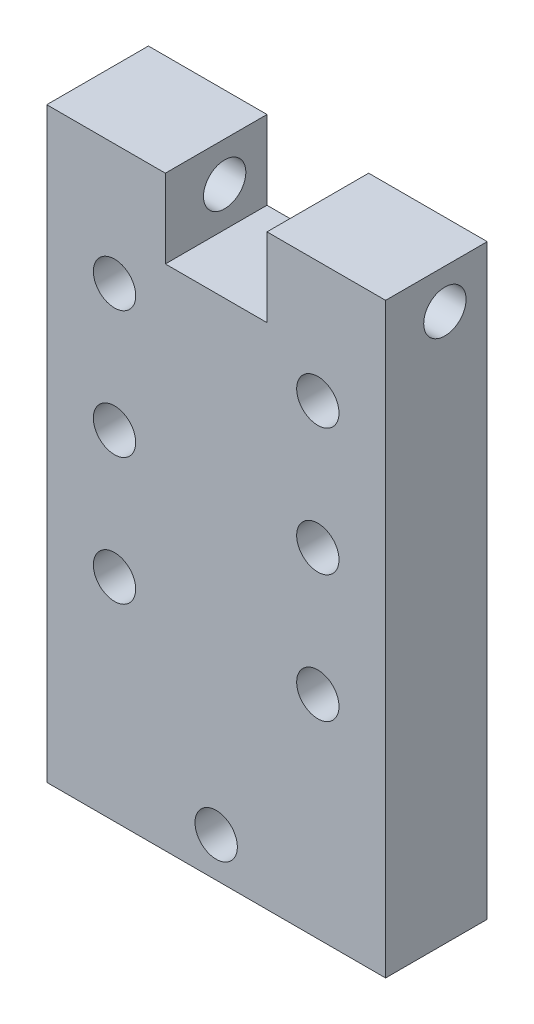
ISO-10303-21;
HEADER;
FILE_DESCRIPTION(('STEP AP214'),'2;1');
FILE_NAME('part.step','',(''),(''),'','','');
FILE_SCHEMA(('AUTOMOTIVE_DESIGN { 1 0 10303 214 1 1 1 1 }'));
ENDSEC;
DATA;
#1=APPLICATION_CONTEXT('core data for automotive mechanical design processes');
#2=APPLICATION_PROTOCOL_DEFINITION('international standard','automotive_design',2000,#1);
#3=PRODUCT_CONTEXT('',#1,'mechanical');
#4=PRODUCT('Part','Part','',(#3));
#5=PRODUCT_RELATED_PRODUCT_CATEGORY('part','',(#4));
#6=PRODUCT_DEFINITION_FORMATION('','',#4);
#7=PRODUCT_DEFINITION_CONTEXT('part definition',#1,'design');
#8=PRODUCT_DEFINITION('design','',#6,#7);
#9=PRODUCT_DEFINITION_SHAPE('','',#8);
#10=(LENGTH_UNIT() NAMED_UNIT(*) SI_UNIT(.MILLI.,.METRE.));
#11=(NAMED_UNIT(*) PLANE_ANGLE_UNIT() SI_UNIT($,.RADIAN.));
#12=(NAMED_UNIT(*) SI_UNIT($,.STERADIAN.) SOLID_ANGLE_UNIT());
#13=UNCERTAINTY_MEASURE_WITH_UNIT(LENGTH_MEASURE(1.E-05),#10,'distance_accuracy_value','');
#14=(GEOMETRIC_REPRESENTATION_CONTEXT(3) GLOBAL_UNCERTAINTY_ASSIGNED_CONTEXT((#13)) GLOBAL_UNIT_ASSIGNED_CONTEXT((#10,
#11,#12)) REPRESENTATION_CONTEXT('',''));
#15=CARTESIAN_POINT('',(0.,0.,0.));
#16=DIRECTION('',(0.,0.,1.));
#17=DIRECTION('',(1.,0.,0.));
#18=AXIS2_PLACEMENT_3D('',#15,#16,#17);
#19=CARTESIAN_POINT('',(12.,-9.64101615137754,12.));
#20=DIRECTION('',(0.,0.,-1.));
#21=DIRECTION('',(-1.,0.,0.));
#22=AXIS2_PLACEMENT_3D('',#19,#20,#21);
#23=CYLINDRICAL_SURFACE('',#22,2.5);
#24=CARTESIAN_POINT('',(12.,-9.64101615137754,12.));
#25=DIRECTION('',(0.,0.,-1.));
#26=DIRECTION('',(-1.,0.,0.));
#27=AXIS2_PLACEMENT_3D('',#24,#25,#26);
#28=CIRCLE('',#27,2.5);
#29=CARTESIAN_POINT('',(9.5,-9.64101615137754,12.));
#30=VERTEX_POINT('',#29);
#31=EDGE_CURVE('E180',#30,#30,#28,.T.);
#32=ORIENTED_EDGE('',*,*,#31,.F.);
#33=EDGE_LOOP('',(#32));
#34=FACE_BOUND('',#33,.T.);
#35=CARTESIAN_POINT('',(12.,-9.64101615137754,3.));
#36=DIRECTION('',(0.,0.,-1.));
#37=DIRECTION('',(-1.,0.,0.));
#38=AXIS2_PLACEMENT_3D('',#35,#36,#37);
#39=CIRCLE('',#38,2.5);
#40=CARTESIAN_POINT('',(9.5,-9.64101615137754,3.));
#41=VERTEX_POINT('',#40);
#42=EDGE_CURVE('E37',#41,#41,#39,.F.);
#43=ORIENTED_EDGE('',*,*,#42,.F.);
#44=EDGE_LOOP('',(#43));
#45=FACE_BOUND('',#44,.T.);
#46=ADVANCED_FACE('F33',(#34,#45),#23,.F.);
#47=CARTESIAN_POINT('',(12.,5.35898384862245,12.));
#48=DIRECTION('',(0.,0.,-1.));
#49=DIRECTION('',(-1.,0.,0.));
#50=AXIS2_PLACEMENT_3D('',#47,#48,#49);
#51=CYLINDRICAL_SURFACE('',#50,2.5);
#52=CARTESIAN_POINT('',(12.,5.35898384862245,12.));
#53=DIRECTION('',(0.,0.,-1.));
#54=DIRECTION('',(-1.,0.,0.));
#55=AXIS2_PLACEMENT_3D('',#52,#53,#54);
#56=CIRCLE('',#55,2.5);
#57=CARTESIAN_POINT('',(9.5,5.35898384862245,12.));
#58=VERTEX_POINT('',#57);
#59=EDGE_CURVE('E183',#58,#58,#56,.T.);
#60=ORIENTED_EDGE('',*,*,#59,.F.);
#61=EDGE_LOOP('',(#60));
#62=FACE_BOUND('',#61,.T.);
#63=CARTESIAN_POINT('',(12.,5.35898384862245,3.));
#64=DIRECTION('',(0.,0.,-1.));
#65=DIRECTION('',(-1.,0.,0.));
#66=AXIS2_PLACEMENT_3D('',#63,#64,#65);
#67=CIRCLE('',#66,2.5);
#68=CARTESIAN_POINT('',(9.5,5.35898384862245,3.));
#69=VERTEX_POINT('',#68);
#70=EDGE_CURVE('E162',#69,#69,#67,.F.);
#71=ORIENTED_EDGE('',*,*,#70,.F.);
#72=EDGE_LOOP('',(#71));
#73=FACE_BOUND('',#72,.T.);
#74=ADVANCED_FACE('F245',(#62,#73),#51,.F.);
#75=CARTESIAN_POINT('',(12.,20.3589838486225,12.));
#76=DIRECTION('',(0.,0.,-1.));
#77=DIRECTION('',(-1.,0.,0.));
#78=AXIS2_PLACEMENT_3D('',#75,#76,#77);
#79=CYLINDRICAL_SURFACE('',#78,2.5);
#80=CARTESIAN_POINT('',(12.,20.3589838486225,12.));
#81=DIRECTION('',(0.,0.,-1.));
#82=DIRECTION('',(-1.,0.,0.));
#83=AXIS2_PLACEMENT_3D('',#80,#81,#82);
#84=CIRCLE('',#83,2.5);
#85=CARTESIAN_POINT('',(9.50000000000001,20.3589838486225,12.));
#86=VERTEX_POINT('',#85);
#87=EDGE_CURVE('E338',#86,#86,#84,.T.);
#88=ORIENTED_EDGE('',*,*,#87,.F.);
#89=EDGE_LOOP('',(#88));
#90=FACE_BOUND('',#89,.T.);
#91=CARTESIAN_POINT('',(12.,20.3589838486225,3.));
#92=DIRECTION('',(0.,0.,-1.));
#93=DIRECTION('',(-1.,0.,0.));
#94=AXIS2_PLACEMENT_3D('',#91,#92,#93);
#95=CIRCLE('',#94,2.5);
#96=CARTESIAN_POINT('',(9.50000000000001,20.3589838486225,3.));
#97=VERTEX_POINT('',#96);
#98=EDGE_CURVE('E160',#97,#97,#95,.F.);
#99=ORIENTED_EDGE('',*,*,#98,.F.);
#100=EDGE_LOOP('',(#99));
#101=FACE_BOUND('',#100,.T.);
#102=ADVANCED_FACE('F251',(#90,#101),#79,.F.);
#103=CARTESIAN_POINT('',(-12.,20.3589838486225,12.));
#104=DIRECTION('',(0.,0.,-1.));
#105=DIRECTION('',(-1.,0.,0.));
#106=AXIS2_PLACEMENT_3D('',#103,#104,#105);
#107=CYLINDRICAL_SURFACE('',#106,2.5);
#108=CARTESIAN_POINT('',(-12.,20.3589838486225,12.));
#109=DIRECTION('',(0.,0.,-1.));
#110=DIRECTION('',(1.,0.,0.));
#111=AXIS2_PLACEMENT_3D('',#108,#109,#110);
#112=CIRCLE('',#111,2.5);
#113=CARTESIAN_POINT('',(-9.50000000000001,20.3589838486225,12.));
#114=VERTEX_POINT('',#113);
#115=EDGE_CURVE('E176',#114,#114,#112,.T.);
#116=ORIENTED_EDGE('',*,*,#115,.F.);
#117=EDGE_LOOP('',(#116));
#118=FACE_BOUND('',#117,.T.);
#119=CARTESIAN_POINT('',(-12.,20.3589838486225,3.));
#120=DIRECTION('',(0.,0.,-1.));
#121=DIRECTION('',(-1.,0.,0.));
#122=AXIS2_PLACEMENT_3D('',#119,#120,#121);
#123=CIRCLE('',#122,2.5);
#124=CARTESIAN_POINT('',(-14.5,20.3589838486225,3.));
#125=VERTEX_POINT('',#124);
#126=EDGE_CURVE('E157',#125,#125,#123,.F.);
#127=ORIENTED_EDGE('',*,*,#126,.F.);
#128=EDGE_LOOP('',(#127));
#129=FACE_BOUND('',#128,.T.);
#130=ADVANCED_FACE('F345',(#118,#129),#107,.F.);
#131=CARTESIAN_POINT('',(-12.,5.35898384862245,12.));
#132=DIRECTION('',(0.,0.,-1.));
#133=DIRECTION('',(-1.,0.,0.));
#134=AXIS2_PLACEMENT_3D('',#131,#132,#133);
#135=CYLINDRICAL_SURFACE('',#134,2.5);
#136=CARTESIAN_POINT('',(-12.,5.35898384862245,12.));
#137=DIRECTION('',(0.,0.,-1.));
#138=DIRECTION('',(1.,0.,0.));
#139=AXIS2_PLACEMENT_3D('',#136,#137,#138);
#140=CIRCLE('',#139,2.5);
#141=CARTESIAN_POINT('',(-9.5,5.35898384862245,12.));
#142=VERTEX_POINT('',#141);
#143=EDGE_CURVE('E171',#142,#142,#140,.T.);
#144=ORIENTED_EDGE('',*,*,#143,.F.);
#145=EDGE_LOOP('',(#144));
#146=FACE_BOUND('',#145,.T.);
#147=CARTESIAN_POINT('',(-12.,5.35898384862245,3.));
#148=DIRECTION('',(0.,0.,-1.));
#149=DIRECTION('',(-1.,0.,0.));
#150=AXIS2_PLACEMENT_3D('',#147,#148,#149);
#151=CIRCLE('',#150,2.5);
#152=CARTESIAN_POINT('',(-14.5,5.35898384862245,3.));
#153=VERTEX_POINT('',#152);
#154=EDGE_CURVE('E153',#153,#153,#151,.F.);
#155=ORIENTED_EDGE('',*,*,#154,.F.);
#156=EDGE_LOOP('',(#155));
#157=FACE_BOUND('',#156,.T.);
#158=ADVANCED_FACE('F348',(#146,#157),#135,.F.);
#159=CARTESIAN_POINT('',(-12.,-9.64101615137754,12.));
#160=DIRECTION('',(0.,0.,-1.));
#161=DIRECTION('',(-1.,0.,0.));
#162=AXIS2_PLACEMENT_3D('',#159,#160,#161);
#163=CYLINDRICAL_SURFACE('',#162,2.5);
#164=CARTESIAN_POINT('',(-12.,-9.64101615137754,12.));
#165=DIRECTION('',(0.,0.,-1.));
#166=DIRECTION('',(1.,0.,0.));
#167=AXIS2_PLACEMENT_3D('',#164,#165,#166);
#168=CIRCLE('',#167,2.5);
#169=CARTESIAN_POINT('',(-9.5,-9.64101615137754,12.));
#170=VERTEX_POINT('',#169);
#171=EDGE_CURVE('E167',#170,#170,#168,.T.);
#172=ORIENTED_EDGE('',*,*,#171,.F.);
#173=EDGE_LOOP('',(#172));
#174=FACE_BOUND('',#173,.T.);
#175=CARTESIAN_POINT('',(-12.,-9.64101615137754,3.));
#176=DIRECTION('',(0.,0.,-1.));
#177=DIRECTION('',(-1.,0.,0.));
#178=AXIS2_PLACEMENT_3D('',#175,#176,#177);
#179=CIRCLE('',#178,2.5);
#180=CARTESIAN_POINT('',(-14.5,-9.64101615137754,3.));
#181=VERTEX_POINT('',#180);
#182=EDGE_CURVE('E150',#181,#181,#179,.F.);
#183=ORIENTED_EDGE('',*,*,#182,.F.);
#184=EDGE_LOOP('',(#183));
#185=FACE_BOUND('',#184,.T.);
#186=ADVANCED_FACE('F243',(#174,#185),#163,.F.);
#187=CARTESIAN_POINT('',(-20.,34.6410161513776,12.));
#188=DIRECTION('',(0.,-1.,0.));
#189=DIRECTION('',(0.,0.,-1.));
#190=AXIS2_PLACEMENT_3D('',#187,#188,#189);
#191=PLANE('',#190);
#192=DIRECTION('',(-1.,0.,0.));
#193=VECTOR('',#192,1.);
#194=CARTESIAN_POINT('',(-20.,34.6410161513776,0.));
#195=LINE('',#194,#193);
#196=CARTESIAN_POINT('',(20.,34.6410161513776,0.));
#197=VERTEX_POINT('',#196);
#198=CARTESIAN_POINT('',(6.,34.6410161513776,0.));
#199=VERTEX_POINT('',#198);
#200=EDGE_CURVE('E121',#197,#199,#195,.T.);
#201=ORIENTED_EDGE('',*,*,#200,.T.);
#202=DIRECTION('',(0.,0.,1.));
#203=VECTOR('',#202,1.);
#204=CARTESIAN_POINT('',(6.,34.6410161513776,0.));
#205=LINE('',#204,#203);
#206=CARTESIAN_POINT('',(6.,34.6410161513776,12.));
#207=VERTEX_POINT('',#206);
#208=EDGE_CURVE('E109',#199,#207,#205,.T.);
#209=ORIENTED_EDGE('',*,*,#208,.T.);
#210=DIRECTION('',(-1.,0.,0.));
#211=VECTOR('',#210,1.);
#212=CARTESIAN_POINT('',(-20.,34.6410161513776,12.));
#213=LINE('',#212,#211);
#214=CARTESIAN_POINT('',(20.,34.6410161513776,12.));
#215=VERTEX_POINT('',#214);
#216=EDGE_CURVE('E87',#215,#207,#213,.T.);
#217=ORIENTED_EDGE('',*,*,#216,.F.);
#218=DIRECTION('',(0.,0.,-1.));
#219=VECTOR('',#218,1.);
#220=CARTESIAN_POINT('',(20.,34.6410161513776,12.));
#221=LINE('',#220,#219);
#222=EDGE_CURVE('E11',#215,#197,#221,.T.);
#223=ORIENTED_EDGE('',*,*,#222,.T.);
#224=EDGE_LOOP('',(#201,#209,#217,#223));
#225=FACE_BOUND('',#224,.T.);
#226=ADVANCED_FACE('F126',(#225),#191,.F.);
#227=CARTESIAN_POINT('',(20.,-34.6410161513775,12.));
#228=DIRECTION('',(-1.,0.,0.));
#229=DIRECTION('',(0.,0.,1.));
#230=AXIS2_PLACEMENT_3D('',#227,#228,#229);
#231=PLANE('',#230);
#232=CARTESIAN_POINT('',(20.,30.,5.));
#233=DIRECTION('',(-1.,0.,0.));
#234=DIRECTION('',(0.,0.,1.));
#235=AXIS2_PLACEMENT_3D('',#232,#233,#234);
#236=CIRCLE('',#235,2.5);
#237=CARTESIAN_POINT('',(20.,30.,7.5));
#238=VERTEX_POINT('',#237);
#239=EDGE_CURVE('E188',#238,#238,#236,.T.);
#240=ORIENTED_EDGE('',*,*,#239,.T.);
#241=EDGE_LOOP('',(#240));
#242=FACE_BOUND('',#241,.T.);
#243=DIRECTION('',(0.,1.,0.));
#244=VECTOR('',#243,1.);
#245=CARTESIAN_POINT('',(20.,-34.6410161513775,0.));
#246=LINE('',#245,#244);
#247=CARTESIAN_POINT('',(20.,-34.6410161513775,0.));
#248=VERTEX_POINT('',#247);
#249=EDGE_CURVE('E133',#248,#197,#246,.T.);
#250=ORIENTED_EDGE('',*,*,#249,.T.);
#251=ORIENTED_EDGE('',*,*,#222,.F.);
#252=DIRECTION('',(0.,1.,0.));
#253=VECTOR('',#252,1.);
#254=CARTESIAN_POINT('',(20.,-34.6410161513775,12.));
#255=LINE('',#254,#253);
#256=CARTESIAN_POINT('',(20.,-34.6410161513775,12.));
#257=VERTEX_POINT('',#256);
#258=EDGE_CURVE('E138',#257,#215,#255,.T.);
#259=ORIENTED_EDGE('',*,*,#258,.F.);
#260=DIRECTION('',(0.,0.,-1.));
#261=VECTOR('',#260,1.);
#262=CARTESIAN_POINT('',(20.,-34.6410161513775,12.));
#263=LINE('',#262,#261);
#264=EDGE_CURVE('E139',#257,#248,#263,.T.);
#265=ORIENTED_EDGE('',*,*,#264,.T.);
#266=EDGE_LOOP('',(#250,#251,#259,#265));
#267=FACE_BOUND('',#266,.T.);
#268=ADVANCED_FACE('F35',(#242,#267),#231,.F.);
#269=CARTESIAN_POINT('',(-6.,34.6410161513776,12.));
#270=VERTEX_POINT('',#269);
#271=CARTESIAN_POINT('',(-20.,34.6410161513776,12.));
#272=VERTEX_POINT('',#271);
#273=EDGE_CURVE('E211',#270,#272,#213,.T.);
#274=ORIENTED_EDGE('',*,*,#273,.F.);
#275=DIRECTION('',(0.,0.,1.));
#276=VECTOR('',#275,1.);
#277=CARTESIAN_POINT('',(-6.,34.6410161513776,0.));
#278=LINE('',#277,#276);
#279=CARTESIAN_POINT('',(-6.,34.6410161513776,0.));
#280=VERTEX_POINT('',#279);
#281=EDGE_CURVE('E116',#280,#270,#278,.T.);
#282=ORIENTED_EDGE('',*,*,#281,.F.);
#283=CARTESIAN_POINT('',(-20.,34.6410161513776,0.));
#284=VERTEX_POINT('',#283);
#285=EDGE_CURVE('E130',#280,#284,#195,.T.);
#286=ORIENTED_EDGE('',*,*,#285,.T.);
#287=DIRECTION('',(0.,0.,-1.));
#288=VECTOR('',#287,1.);
#289=CARTESIAN_POINT('',(-20.,34.6410161513776,12.));
#290=LINE('',#289,#288);
#291=EDGE_CURVE('E42',#272,#284,#290,.T.);
#292=ORIENTED_EDGE('',*,*,#291,.F.);
#293=EDGE_LOOP('',(#274,#282,#286,#292));
#294=FACE_BOUND('',#293,.T.);
#295=ADVANCED_FACE('F233',(#294),#191,.F.);
#296=CARTESIAN_POINT('',(-20.,-34.6410161513775,12.));
#297=DIRECTION('',(1.,0.,0.));
#298=DIRECTION('',(0.,0.,-1.));
#299=AXIS2_PLACEMENT_3D('',#296,#297,#298);
#300=PLANE('',#299);
#301=CARTESIAN_POINT('',(-20.,30.,5.));
#302=DIRECTION('',(-1.,0.,0.));
#303=DIRECTION('',(0.,0.,1.));
#304=AXIS2_PLACEMENT_3D('',#301,#302,#303);
#305=CIRCLE('',#304,2.5);
#306=CARTESIAN_POINT('',(-20.,30.,7.5));
#307=VERTEX_POINT('',#306);
#308=EDGE_CURVE('E149',#307,#307,#305,.T.);
#309=ORIENTED_EDGE('',*,*,#308,.F.);
#310=EDGE_LOOP('',(#309));
#311=FACE_BOUND('',#310,.T.);
#312=DIRECTION('',(0.,-1.,0.));
#313=VECTOR('',#312,1.);
#314=CARTESIAN_POINT('',(-20.,-34.6410161513775,0.));
#315=LINE('',#314,#313);
#316=CARTESIAN_POINT('',(-20.,-34.6410161513775,0.));
#317=VERTEX_POINT('',#316);
#318=EDGE_CURVE('E129',#284,#317,#315,.T.);
#319=ORIENTED_EDGE('',*,*,#318,.T.);
#320=DIRECTION('',(0.,0.,-1.));
#321=VECTOR('',#320,1.);
#322=CARTESIAN_POINT('',(-20.,-34.6410161513775,12.));
#323=LINE('',#322,#321);
#324=CARTESIAN_POINT('',(-20.,-34.6410161513775,12.));
#325=VERTEX_POINT('',#324);
#326=EDGE_CURVE('E141',#325,#317,#323,.T.);
#327=ORIENTED_EDGE('',*,*,#326,.F.);
#328=DIRECTION('',(0.,-1.,0.));
#329=VECTOR('',#328,1.);
#330=CARTESIAN_POINT('',(-20.,-34.6410161513775,12.));
#331=LINE('',#330,#329);
#332=EDGE_CURVE('E213',#272,#325,#331,.T.);
#333=ORIENTED_EDGE('',*,*,#332,.F.);
#334=ORIENTED_EDGE('',*,*,#291,.T.);
#335=EDGE_LOOP('',(#319,#327,#333,#334));
#336=FACE_BOUND('',#335,.T.);
#337=ADVANCED_FACE('F221',(#311,#336),#300,.F.);
#338=CARTESIAN_POINT('',(-20.,-34.6410161513775,12.));
#339=DIRECTION('',(0.,1.,0.));
#340=DIRECTION('',(0.,0.,1.));
#341=AXIS2_PLACEMENT_3D('',#338,#339,#340);
#342=PLANE('',#341);
#343=CARTESIAN_POINT('',(-10.,-34.6410161513775,6.));
#344=DIRECTION('',(0.,-1.,0.));
#345=DIRECTION('',(0.,0.,-1.));
#346=AXIS2_PLACEMENT_3D('',#343,#344,#345);
#347=CIRCLE('',#346,2.5);
#348=CARTESIAN_POINT('',(-10.,-34.6410161513775,3.5));
#349=VERTEX_POINT('',#348);
#350=EDGE_CURVE('E289',#349,#349,#347,.T.);
#351=ORIENTED_EDGE('',*,*,#350,.F.);
#352=EDGE_LOOP('',(#351));
#353=FACE_BOUND('',#352,.T.);
#354=CARTESIAN_POINT('',(10.,-34.6410161513775,6.));
#355=DIRECTION('',(0.,-1.,0.));
#356=DIRECTION('',(0.,0.,-1.));
#357=AXIS2_PLACEMENT_3D('',#354,#355,#356);
#358=CIRCLE('',#357,2.5);
#359=CARTESIAN_POINT('',(10.,-34.6410161513775,3.5));
#360=VERTEX_POINT('',#359);
#361=EDGE_CURVE('E292',#360,#360,#358,.T.);
#362=ORIENTED_EDGE('',*,*,#361,.F.);
#363=EDGE_LOOP('',(#362));
#364=FACE_BOUND('',#363,.T.);
#365=DIRECTION('',(1.,0.,0.));
#366=VECTOR('',#365,1.);
#367=CARTESIAN_POINT('',(-20.,-34.6410161513775,0.));
#368=LINE('',#367,#366);
#369=EDGE_CURVE('E80',#317,#248,#368,.T.);
#370=ORIENTED_EDGE('',*,*,#369,.T.);
#371=ORIENTED_EDGE('',*,*,#264,.F.);
#372=DIRECTION('',(1.,0.,0.));
#373=VECTOR('',#372,1.);
#374=CARTESIAN_POINT('',(-20.,-34.6410161513775,12.));
#375=LINE('',#374,#373);
#376=EDGE_CURVE('E59',#325,#257,#375,.T.);
#377=ORIENTED_EDGE('',*,*,#376,.F.);
#378=ORIENTED_EDGE('',*,*,#326,.T.);
#379=EDGE_LOOP('',(#370,#371,#377,#378));
#380=FACE_BOUND('',#379,.T.);
#381=ADVANCED_FACE('F223',(#353,#364,#380),#342,.F.);
#382=CARTESIAN_POINT('',(0.,0.,12.));
#383=DIRECTION('',(0.,0.,-1.));
#384=DIRECTION('',(-1.,0.,0.));
#385=AXIS2_PLACEMENT_3D('',#382,#383,#384);
#386=PLANE('',#385);
#387=ORIENTED_EDGE('',*,*,#171,.T.);
#388=EDGE_LOOP('',(#387));
#389=FACE_BOUND('',#388,.T.);
#390=ORIENTED_EDGE('',*,*,#143,.T.);
#391=EDGE_LOOP('',(#390));
#392=FACE_BOUND('',#391,.T.);
#393=ORIENTED_EDGE('',*,*,#115,.T.);
#394=EDGE_LOOP('',(#393));
#395=FACE_BOUND('',#394,.T.);
#396=ORIENTED_EDGE('',*,*,#87,.T.);
#397=EDGE_LOOP('',(#396));
#398=FACE_BOUND('',#397,.T.);
#399=ORIENTED_EDGE('',*,*,#59,.T.);
#400=EDGE_LOOP('',(#399));
#401=FACE_BOUND('',#400,.T.);
#402=ORIENTED_EDGE('',*,*,#31,.T.);
#403=EDGE_LOOP('',(#402));
#404=FACE_BOUND('',#403,.T.);
#405=CARTESIAN_POINT('',(0.,-30.,12.));
#406=DIRECTION('',(0.,0.,1.));
#407=DIRECTION('',(1.,0.,0.));
#408=AXIS2_PLACEMENT_3D('',#405,#406,#407);
#409=CIRCLE('',#408,2.5);
#410=CARTESIAN_POINT('',(2.5,-30.,12.));
#411=VERTEX_POINT('',#410);
#412=EDGE_CURVE('E194',#411,#411,#409,.T.);
#413=ORIENTED_EDGE('',*,*,#412,.F.);
#414=EDGE_LOOP('',(#413));
#415=FACE_BOUND('',#414,.T.);
#416=ORIENTED_EDGE('',*,*,#216,.T.);
#417=DIRECTION('',(0.,1.,0.));
#418=VECTOR('',#417,1.);
#419=CARTESIAN_POINT('',(6.,25.3589838486224,12.));
#420=LINE('',#419,#418);
#421=CARTESIAN_POINT('',(6.,25.3589838486224,12.));
#422=VERTEX_POINT('',#421);
#423=EDGE_CURVE('E114',#422,#207,#420,.T.);
#424=ORIENTED_EDGE('',*,*,#423,.F.);
#425=DIRECTION('',(1.,0.,0.));
#426=VECTOR('',#425,1.);
#427=CARTESIAN_POINT('',(-6.,25.3589838486224,12.));
#428=LINE('',#427,#426);
#429=CARTESIAN_POINT('',(-6.,25.3589838486224,12.));
#430=VERTEX_POINT('',#429);
#431=EDGE_CURVE('E124',#430,#422,#428,.T.);
#432=ORIENTED_EDGE('',*,*,#431,.F.);
#433=DIRECTION('',(0.,-1.,0.));
#434=VECTOR('',#433,1.);
#435=CARTESIAN_POINT('',(-6.,25.3589838486224,12.));
#436=LINE('',#435,#434);
#437=EDGE_CURVE('E201',#270,#430,#436,.T.);
#438=ORIENTED_EDGE('',*,*,#437,.F.);
#439=ORIENTED_EDGE('',*,*,#273,.T.);
#440=ORIENTED_EDGE('',*,*,#332,.T.);
#441=ORIENTED_EDGE('',*,*,#376,.T.);
#442=ORIENTED_EDGE('',*,*,#258,.T.);
#443=EDGE_LOOP('',(#416,#424,#432,#438,#439,#440,#441,#442));
#444=FACE_BOUND('',#443,.T.);
#445=ADVANCED_FACE('F216',(#389,#392,#395,#398,#401,#404,#415,#444),#386,.F.);
#446=CARTESIAN_POINT('',(0.,0.,0.));
#447=DIRECTION('',(0.,0.,-1.));
#448=DIRECTION('',(-1.,0.,0.));
#449=AXIS2_PLACEMENT_3D('',#446,#447,#448);
#450=PLANE('',#449);
#451=CARTESIAN_POINT('',(12.,5.35898384862245,0.));
#452=DIRECTION('',(0.,0.,-1.));
#453=DIRECTION('',(-1.,0.,0.));
#454=AXIS2_PLACEMENT_3D('',#451,#452,#453);
#455=CIRCLE('',#454,4.5);
#456=CARTESIAN_POINT('',(7.5,5.35898384862245,0.));
#457=VERTEX_POINT('',#456);
#458=EDGE_CURVE('E312',#457,#457,#455,.T.);
#459=ORIENTED_EDGE('',*,*,#458,.F.);
#460=EDGE_LOOP('',(#459));
#461=FACE_BOUND('',#460,.T.);
#462=CARTESIAN_POINT('',(12.,20.3589838486225,0.));
#463=DIRECTION('',(0.,0.,-1.));
#464=DIRECTION('',(-1.,0.,0.));
#465=AXIS2_PLACEMENT_3D('',#462,#463,#464);
#466=CIRCLE('',#465,4.5);
#467=CARTESIAN_POINT('',(7.50000000000001,20.3589838486225,0.));
#468=VERTEX_POINT('',#467);
#469=EDGE_CURVE('E318',#468,#468,#466,.T.);
#470=ORIENTED_EDGE('',*,*,#469,.F.);
#471=EDGE_LOOP('',(#470));
#472=FACE_BOUND('',#471,.T.);
#473=CARTESIAN_POINT('',(-12.,-9.64101615137754,0.));
#474=DIRECTION('',(0.,0.,-1.));
#475=DIRECTION('',(-1.,0.,0.));
#476=AXIS2_PLACEMENT_3D('',#473,#474,#475);
#477=CIRCLE('',#476,4.5);
#478=CARTESIAN_POINT('',(-16.5,-9.64101615137754,0.));
#479=VERTEX_POINT('',#478);
#480=EDGE_CURVE('E324',#479,#479,#477,.T.);
#481=ORIENTED_EDGE('',*,*,#480,.F.);
#482=EDGE_LOOP('',(#481));
#483=FACE_BOUND('',#482,.T.);
#484=CARTESIAN_POINT('',(-12.,5.35898384862245,0.));
#485=DIRECTION('',(0.,0.,-1.));
#486=DIRECTION('',(-1.,0.,0.));
#487=AXIS2_PLACEMENT_3D('',#484,#485,#486);
#488=CIRCLE('',#487,4.5);
#489=CARTESIAN_POINT('',(-16.5,5.35898384862245,0.));
#490=VERTEX_POINT('',#489);
#491=EDGE_CURVE('E303',#490,#490,#488,.T.);
#492=ORIENTED_EDGE('',*,*,#491,.F.);
#493=EDGE_LOOP('',(#492));
#494=FACE_BOUND('',#493,.T.);
#495=CARTESIAN_POINT('',(-12.,20.3589838486225,0.));
#496=DIRECTION('',(0.,0.,-1.));
#497=DIRECTION('',(-1.,0.,0.));
#498=AXIS2_PLACEMENT_3D('',#495,#496,#497);
#499=CIRCLE('',#498,4.5);
#500=CARTESIAN_POINT('',(-16.5,20.3589838486225,0.));
#501=VERTEX_POINT('',#500);
#502=EDGE_CURVE('E304',#501,#501,#499,.T.);
#503=ORIENTED_EDGE('',*,*,#502,.F.);
#504=EDGE_LOOP('',(#503));
#505=FACE_BOUND('',#504,.T.);
#506=CARTESIAN_POINT('',(12.,-9.64101615137754,0.));
#507=DIRECTION('',(0.,0.,-1.));
#508=DIRECTION('',(-1.,0.,0.));
#509=AXIS2_PLACEMENT_3D('',#506,#507,#508);
#510=CIRCLE('',#509,4.5);
#511=CARTESIAN_POINT('',(7.5,-9.64101615137754,0.));
#512=VERTEX_POINT('',#511);
#513=EDGE_CURVE('E311',#512,#512,#510,.T.);
#514=ORIENTED_EDGE('',*,*,#513,.F.);
#515=EDGE_LOOP('',(#514));
#516=FACE_BOUND('',#515,.T.);
#517=CARTESIAN_POINT('',(0.,-30.,0.));
#518=DIRECTION('',(0.,0.,1.));
#519=DIRECTION('',(1.,0.,0.));
#520=AXIS2_PLACEMENT_3D('',#517,#518,#519);
#521=CIRCLE('',#520,2.5);
#522=CARTESIAN_POINT('',(2.5,-30.,0.));
#523=VERTEX_POINT('',#522);
#524=EDGE_CURVE('E191',#523,#523,#521,.T.);
#525=ORIENTED_EDGE('',*,*,#524,.T.);
#526=EDGE_LOOP('',(#525));
#527=FACE_BOUND('',#526,.T.);
#528=DIRECTION('',(0.,1.,0.));
#529=VECTOR('',#528,1.);
#530=CARTESIAN_POINT('',(6.,25.3589838486224,0.));
#531=LINE('',#530,#529);
#532=CARTESIAN_POINT('',(6.,25.3589838486224,0.));
#533=VERTEX_POINT('',#532);
#534=EDGE_CURVE('E112',#533,#199,#531,.T.);
#535=ORIENTED_EDGE('',*,*,#534,.T.);
#536=ORIENTED_EDGE('',*,*,#200,.F.);
#537=ORIENTED_EDGE('',*,*,#249,.F.);
#538=ORIENTED_EDGE('',*,*,#369,.F.);
#539=ORIENTED_EDGE('',*,*,#318,.F.);
#540=ORIENTED_EDGE('',*,*,#285,.F.);
#541=DIRECTION('',(0.,-1.,0.));
#542=VECTOR('',#541,1.);
#543=CARTESIAN_POINT('',(-6.,25.3589838486224,0.));
#544=LINE('',#543,#542);
#545=CARTESIAN_POINT('',(-6.,25.3589838486224,0.));
#546=VERTEX_POINT('',#545);
#547=EDGE_CURVE('E123',#280,#546,#544,.T.);
#548=ORIENTED_EDGE('',*,*,#547,.T.);
#549=DIRECTION('',(1.,0.,0.));
#550=VECTOR('',#549,1.);
#551=CARTESIAN_POINT('',(-6.,25.3589838486224,0.));
#552=LINE('',#551,#550);
#553=EDGE_CURVE('E50',#546,#533,#552,.T.);
#554=ORIENTED_EDGE('',*,*,#553,.T.);
#555=EDGE_LOOP('',(#535,#536,#537,#538,#539,#540,#548,#554));
#556=FACE_BOUND('',#555,.T.);
#557=ADVANCED_FACE('F119',(#461,#472,#483,#494,#505,#516,#527,#556),#450,.T.);
#558=CARTESIAN_POINT('',(6.,25.3589838486224,0.));
#559=DIRECTION('',(1.,0.,0.));
#560=DIRECTION('',(0.,0.,-1.));
#561=AXIS2_PLACEMENT_3D('',#558,#559,#560);
#562=PLANE('',#561);
#563=CARTESIAN_POINT('',(6.00000000000001,30.,5.));
#564=DIRECTION('',(1.,0.,0.));
#565=DIRECTION('',(0.,0.,-1.));
#566=AXIS2_PLACEMENT_3D('',#563,#564,#565);
#567=CIRCLE('',#566,2.5);
#568=CARTESIAN_POINT('',(6.00000000000001,30.,2.5));
#569=VERTEX_POINT('',#568);
#570=EDGE_CURVE('E148',#569,#569,#567,.T.);
#571=ORIENTED_EDGE('',*,*,#570,.T.);
#572=EDGE_LOOP('',(#571));
#573=FACE_BOUND('',#572,.T.);
#574=ORIENTED_EDGE('',*,*,#423,.T.);
#575=ORIENTED_EDGE('',*,*,#208,.F.);
#576=ORIENTED_EDGE('',*,*,#534,.F.);
#577=DIRECTION('',(0.,0.,1.));
#578=VECTOR('',#577,1.);
#579=CARTESIAN_POINT('',(6.,25.3589838486224,0.));
#580=LINE('',#579,#578);
#581=EDGE_CURVE('E196',#533,#422,#580,.T.);
#582=ORIENTED_EDGE('',*,*,#581,.T.);
#583=EDGE_LOOP('',(#574,#575,#576,#582));
#584=FACE_BOUND('',#583,.T.);
#585=ADVANCED_FACE('F111',(#573,#584),#562,.F.);
#586=CARTESIAN_POINT('',(-6.,25.3589838486224,0.));
#587=DIRECTION('',(0.,-1.,0.));
#588=DIRECTION('',(0.,0.,-1.));
#589=AXIS2_PLACEMENT_3D('',#586,#587,#588);
#590=PLANE('',#589);
#591=ORIENTED_EDGE('',*,*,#431,.T.);
#592=ORIENTED_EDGE('',*,*,#581,.F.);
#593=ORIENTED_EDGE('',*,*,#553,.F.);
#594=DIRECTION('',(0.,0.,1.));
#595=VECTOR('',#594,1.);
#596=CARTESIAN_POINT('',(-6.,25.3589838486224,0.));
#597=LINE('',#596,#595);
#598=EDGE_CURVE('E207',#546,#430,#597,.T.);
#599=ORIENTED_EDGE('',*,*,#598,.T.);
#600=EDGE_LOOP('',(#591,#592,#593,#599));
#601=FACE_BOUND('',#600,.T.);
#602=ADVANCED_FACE('F227',(#601),#590,.F.);
#603=CARTESIAN_POINT('',(-6.,25.3589838486224,0.));
#604=DIRECTION('',(-1.,0.,0.));
#605=DIRECTION('',(0.,0.,1.));
#606=AXIS2_PLACEMENT_3D('',#603,#604,#605);
#607=PLANE('',#606);
#608=CARTESIAN_POINT('',(-6.,30.,5.));
#609=DIRECTION('',(-1.,0.,0.));
#610=DIRECTION('',(0.,0.,1.));
#611=AXIS2_PLACEMENT_3D('',#608,#609,#610);
#612=CIRCLE('',#611,2.5);
#613=CARTESIAN_POINT('',(-6.,30.,7.5));
#614=VERTEX_POINT('',#613);
#615=EDGE_CURVE('E145',#614,#614,#612,.T.);
#616=ORIENTED_EDGE('',*,*,#615,.T.);
#617=EDGE_LOOP('',(#616));
#618=FACE_BOUND('',#617,.T.);
#619=ORIENTED_EDGE('',*,*,#437,.T.);
#620=ORIENTED_EDGE('',*,*,#598,.F.);
#621=ORIENTED_EDGE('',*,*,#547,.F.);
#622=ORIENTED_EDGE('',*,*,#281,.T.);
#623=EDGE_LOOP('',(#619,#620,#621,#622));
#624=FACE_BOUND('',#623,.T.);
#625=ADVANCED_FACE('F229',(#618,#624),#607,.F.);
#626=CARTESIAN_POINT('',(0.,-30.,0.));
#627=DIRECTION('',(0.,0.,1.));
#628=DIRECTION('',(1.,0.,0.));
#629=AXIS2_PLACEMENT_3D('',#626,#627,#628);
#630=CYLINDRICAL_SURFACE('',#629,2.5);
#631=ORIENTED_EDGE('',*,*,#524,.F.);
#632=EDGE_LOOP('',(#631));
#633=FACE_BOUND('',#632,.T.);
#634=ORIENTED_EDGE('',*,*,#412,.T.);
#635=EDGE_LOOP('',(#634));
#636=FACE_BOUND('',#635,.T.);
#637=ADVANCED_FACE('F265',(#633,#636),#630,.F.);
#638=CARTESIAN_POINT('',(40.,30.,5.));
#639=DIRECTION('',(-1.,0.,0.));
#640=DIRECTION('',(0.,0.,1.));
#641=AXIS2_PLACEMENT_3D('',#638,#639,#640);
#642=CYLINDRICAL_SURFACE('',#641,2.5);
#643=ORIENTED_EDGE('',*,*,#308,.T.);
#644=EDGE_LOOP('',(#643));
#645=FACE_BOUND('',#644,.T.);
#646=ORIENTED_EDGE('',*,*,#615,.F.);
#647=EDGE_LOOP('',(#646));
#648=FACE_BOUND('',#647,.T.);
#649=ADVANCED_FACE('F263',(#645,#648),#642,.F.);
#650=ORIENTED_EDGE('',*,*,#570,.F.);
#651=EDGE_LOOP('',(#650));
#652=FACE_BOUND('',#651,.T.);
#653=ORIENTED_EDGE('',*,*,#239,.F.);
#654=EDGE_LOOP('',(#653));
#655=FACE_BOUND('',#654,.T.);
#656=ADVANCED_FACE('F259',(#652,#655),#642,.F.);
#657=CARTESIAN_POINT('',(-12.,-9.64101615137754,3.));
#658=DIRECTION('',(0.,0.,-1.));
#659=DIRECTION('',(-1.,0.,0.));
#660=AXIS2_PLACEMENT_3D('',#657,#658,#659);
#661=PLANE('',#660);
#662=CARTESIAN_POINT('',(-12.,-9.64101615137754,3.));
#663=DIRECTION('',(0.,0.,-1.));
#664=DIRECTION('',(-1.,0.,0.));
#665=AXIS2_PLACEMENT_3D('',#662,#663,#664);
#666=CIRCLE('',#665,4.5);
#667=CARTESIAN_POINT('',(-16.5,-9.64101615137754,3.));
#668=VERTEX_POINT('',#667);
#669=EDGE_CURVE('E321',#668,#668,#666,.T.);
#670=ORIENTED_EDGE('',*,*,#669,.T.);
#671=EDGE_LOOP('',(#670));
#672=FACE_BOUND('',#671,.T.);
#673=ORIENTED_EDGE('',*,*,#182,.T.);
#674=EDGE_LOOP('',(#673));
#675=FACE_BOUND('',#674,.T.);
#676=ADVANCED_FACE('F262',(#672,#675),#661,.T.);
#677=CARTESIAN_POINT('',(-12.,-9.64101615137754,3.));
#678=DIRECTION('',(0.,0.,-1.));
#679=DIRECTION('',(-1.,0.,0.));
#680=AXIS2_PLACEMENT_3D('',#677,#678,#679);
#681=CYLINDRICAL_SURFACE('',#680,4.5);
#682=ORIENTED_EDGE('',*,*,#669,.F.);
#683=EDGE_LOOP('',(#682));
#684=FACE_BOUND('',#683,.T.);
#685=ORIENTED_EDGE('',*,*,#480,.T.);
#686=EDGE_LOOP('',(#685));
#687=FACE_BOUND('',#686,.T.);
#688=ADVANCED_FACE('F390',(#684,#687),#681,.F.);
#689=CARTESIAN_POINT('',(-12.,5.35898384862245,3.));
#690=DIRECTION('',(0.,0.,-1.));
#691=DIRECTION('',(-1.,0.,0.));
#692=AXIS2_PLACEMENT_3D('',#689,#690,#691);
#693=PLANE('',#692);
#694=CARTESIAN_POINT('',(-12.,5.35898384862245,3.));
#695=DIRECTION('',(0.,0.,-1.));
#696=DIRECTION('',(-1.,0.,0.));
#697=AXIS2_PLACEMENT_3D('',#694,#695,#696);
#698=CIRCLE('',#697,4.5);
#699=CARTESIAN_POINT('',(-16.5,5.35898384862245,3.));
#700=VERTEX_POINT('',#699);
#701=EDGE_CURVE('E327',#700,#700,#698,.T.);
#702=ORIENTED_EDGE('',*,*,#701,.T.);
#703=EDGE_LOOP('',(#702));
#704=FACE_BOUND('',#703,.T.);
#705=ORIENTED_EDGE('',*,*,#154,.T.);
#706=EDGE_LOOP('',(#705));
#707=FACE_BOUND('',#706,.T.);
#708=ADVANCED_FACE('F365',(#704,#707),#693,.T.);
#709=CARTESIAN_POINT('',(-12.,5.35898384862245,3.));
#710=DIRECTION('',(0.,0.,-1.));
#711=DIRECTION('',(-1.,0.,0.));
#712=AXIS2_PLACEMENT_3D('',#709,#710,#711);
#713=CYLINDRICAL_SURFACE('',#712,4.5);
#714=ORIENTED_EDGE('',*,*,#701,.F.);
#715=EDGE_LOOP('',(#714));
#716=FACE_BOUND('',#715,.T.);
#717=ORIENTED_EDGE('',*,*,#491,.T.);
#718=EDGE_LOOP('',(#717));
#719=FACE_BOUND('',#718,.T.);
#720=ADVANCED_FACE('F355',(#716,#719),#713,.F.);
#721=CARTESIAN_POINT('',(-12.,20.3589838486225,3.));
#722=DIRECTION('',(0.,0.,-1.));
#723=DIRECTION('',(-1.,0.,0.));
#724=AXIS2_PLACEMENT_3D('',#721,#722,#723);
#725=PLANE('',#724);
#726=CARTESIAN_POINT('',(-12.,20.3589838486225,3.));
#727=DIRECTION('',(0.,0.,-1.));
#728=DIRECTION('',(-1.,0.,0.));
#729=AXIS2_PLACEMENT_3D('',#726,#727,#728);
#730=CIRCLE('',#729,4.5);
#731=CARTESIAN_POINT('',(-16.5,20.3589838486225,3.));
#732=VERTEX_POINT('',#731);
#733=EDGE_CURVE('E300',#732,#732,#730,.T.);
#734=ORIENTED_EDGE('',*,*,#733,.T.);
#735=EDGE_LOOP('',(#734));
#736=FACE_BOUND('',#735,.T.);
#737=ORIENTED_EDGE('',*,*,#126,.T.);
#738=EDGE_LOOP('',(#737));
#739=FACE_BOUND('',#738,.T.);
#740=ADVANCED_FACE('F352',(#736,#739),#725,.T.);
#741=CARTESIAN_POINT('',(-12.,20.3589838486225,3.));
#742=DIRECTION('',(0.,0.,-1.));
#743=DIRECTION('',(-1.,0.,0.));
#744=AXIS2_PLACEMENT_3D('',#741,#742,#743);
#745=CYLINDRICAL_SURFACE('',#744,4.5);
#746=ORIENTED_EDGE('',*,*,#733,.F.);
#747=EDGE_LOOP('',(#746));
#748=FACE_BOUND('',#747,.T.);
#749=ORIENTED_EDGE('',*,*,#502,.T.);
#750=EDGE_LOOP('',(#749));
#751=FACE_BOUND('',#750,.T.);
#752=ADVANCED_FACE('F354',(#748,#751),#745,.F.);
#753=CARTESIAN_POINT('',(12.,20.3589838486225,3.));
#754=DIRECTION('',(0.,0.,-1.));
#755=DIRECTION('',(-1.,0.,0.));
#756=AXIS2_PLACEMENT_3D('',#753,#754,#755);
#757=PLANE('',#756);
#758=CARTESIAN_POINT('',(12.,20.3589838486225,3.));
#759=DIRECTION('',(0.,0.,-1.));
#760=DIRECTION('',(-1.,0.,0.));
#761=AXIS2_PLACEMENT_3D('',#758,#759,#760);
#762=CIRCLE('',#761,4.5);
#763=CARTESIAN_POINT('',(7.50000000000001,20.3589838486225,3.));
#764=VERTEX_POINT('',#763);
#765=EDGE_CURVE('E315',#764,#764,#762,.T.);
#766=ORIENTED_EDGE('',*,*,#765,.T.);
#767=EDGE_LOOP('',(#766));
#768=FACE_BOUND('',#767,.T.);
#769=ORIENTED_EDGE('',*,*,#98,.T.);
#770=EDGE_LOOP('',(#769));
#771=FACE_BOUND('',#770,.T.);
#772=ADVANCED_FACE('F362',(#768,#771),#757,.T.);
#773=CARTESIAN_POINT('',(12.,20.3589838486225,3.));
#774=DIRECTION('',(0.,0.,-1.));
#775=DIRECTION('',(-1.,0.,0.));
#776=AXIS2_PLACEMENT_3D('',#773,#774,#775);
#777=CYLINDRICAL_SURFACE('',#776,4.5);
#778=ORIENTED_EDGE('',*,*,#765,.F.);
#779=EDGE_LOOP('',(#778));
#780=FACE_BOUND('',#779,.T.);
#781=ORIENTED_EDGE('',*,*,#469,.T.);
#782=EDGE_LOOP('',(#781));
#783=FACE_BOUND('',#782,.T.);
#784=ADVANCED_FACE('F376',(#780,#783),#777,.F.);
#785=CARTESIAN_POINT('',(12.,5.35898384862245,3.));
#786=DIRECTION('',(0.,0.,-1.));
#787=DIRECTION('',(-1.,0.,0.));
#788=AXIS2_PLACEMENT_3D('',#785,#786,#787);
#789=PLANE('',#788);
#790=CARTESIAN_POINT('',(12.,5.35898384862245,3.));
#791=DIRECTION('',(0.,0.,-1.));
#792=DIRECTION('',(-1.,0.,0.));
#793=AXIS2_PLACEMENT_3D('',#790,#791,#792);
#794=CIRCLE('',#793,4.5);
#795=CARTESIAN_POINT('',(7.5,5.35898384862245,3.));
#796=VERTEX_POINT('',#795);
#797=EDGE_CURVE('E308',#796,#796,#794,.T.);
#798=ORIENTED_EDGE('',*,*,#797,.T.);
#799=EDGE_LOOP('',(#798));
#800=FACE_BOUND('',#799,.T.);
#801=ORIENTED_EDGE('',*,*,#70,.T.);
#802=EDGE_LOOP('',(#801));
#803=FACE_BOUND('',#802,.T.);
#804=ADVANCED_FACE('F372',(#800,#803),#789,.T.);
#805=CARTESIAN_POINT('',(12.,5.35898384862245,3.));
#806=DIRECTION('',(0.,0.,-1.));
#807=DIRECTION('',(-1.,0.,0.));
#808=AXIS2_PLACEMENT_3D('',#805,#806,#807);
#809=CYLINDRICAL_SURFACE('',#808,4.5);
#810=ORIENTED_EDGE('',*,*,#797,.F.);
#811=EDGE_LOOP('',(#810));
#812=FACE_BOUND('',#811,.T.);
#813=ORIENTED_EDGE('',*,*,#458,.T.);
#814=EDGE_LOOP('',(#813));
#815=FACE_BOUND('',#814,.T.);
#816=ADVANCED_FACE('F375',(#812,#815),#809,.F.);
#817=CARTESIAN_POINT('',(12.,-9.64101615137754,3.));
#818=DIRECTION('',(0.,0.,-1.));
#819=DIRECTION('',(-1.,0.,0.));
#820=AXIS2_PLACEMENT_3D('',#817,#818,#819);
#821=PLANE('',#820);
#822=CARTESIAN_POINT('',(12.,-9.64101615137754,3.));
#823=DIRECTION('',(0.,0.,-1.));
#824=DIRECTION('',(-1.,0.,0.));
#825=AXIS2_PLACEMENT_3D('',#822,#823,#824);
#826=CIRCLE('',#825,4.5);
#827=CARTESIAN_POINT('',(7.5,-9.64101615137754,3.));
#828=VERTEX_POINT('',#827);
#829=EDGE_CURVE('E154',#828,#828,#826,.T.);
#830=ORIENTED_EDGE('',*,*,#829,.T.);
#831=EDGE_LOOP('',(#830));
#832=FACE_BOUND('',#831,.T.);
#833=ORIENTED_EDGE('',*,*,#42,.T.);
#834=EDGE_LOOP('',(#833));
#835=FACE_BOUND('',#834,.T.);
#836=ADVANCED_FACE('F380',(#832,#835),#821,.T.);
#837=CARTESIAN_POINT('',(12.,-9.64101615137754,3.));
#838=DIRECTION('',(0.,0.,-1.));
#839=DIRECTION('',(-1.,0.,0.));
#840=AXIS2_PLACEMENT_3D('',#837,#838,#839);
#841=CYLINDRICAL_SURFACE('',#840,4.5);
#842=ORIENTED_EDGE('',*,*,#829,.F.);
#843=EDGE_LOOP('',(#842));
#844=FACE_BOUND('',#843,.T.);
#845=ORIENTED_EDGE('',*,*,#513,.T.);
#846=EDGE_LOOP('',(#845));
#847=FACE_BOUND('',#846,.T.);
#848=ADVANCED_FACE('F400',(#844,#847),#841,.F.);
#849=CARTESIAN_POINT('',(10.,-24.6410161513775,6.));
#850=DIRECTION('',(0.,-1.,0.));
#851=DIRECTION('',(0.,0.,-1.));
#852=AXIS2_PLACEMENT_3D('',#849,#850,#851);
#853=CYLINDRICAL_SURFACE('',#852,2.5);
#854=CARTESIAN_POINT('',(10.,-24.6410161513775,6.));
#855=DIRECTION('',(0.,-1.,0.));
#856=DIRECTION('',(0.,0.,-1.));
#857=AXIS2_PLACEMENT_3D('',#854,#855,#856);
#858=CIRCLE('',#857,2.5);
#859=CARTESIAN_POINT('',(10.,-24.6410161513775,3.5));
#860=VERTEX_POINT('',#859);
#861=EDGE_CURVE('E294',#860,#860,#858,.T.);
#862=ORIENTED_EDGE('',*,*,#861,.F.);
#863=EDGE_LOOP('',(#862));
#864=FACE_BOUND('',#863,.T.);
#865=ORIENTED_EDGE('',*,*,#361,.T.);
#866=EDGE_LOOP('',(#865));
#867=FACE_BOUND('',#866,.T.);
#868=ADVANCED_FACE('F369',(#864,#867),#853,.F.);
#869=CARTESIAN_POINT('',(10.,-24.6410161513775,6.));
#870=DIRECTION('',(0.,-1.,0.));
#871=DIRECTION('',(0.,0.,-1.));
#872=AXIS2_PLACEMENT_3D('',#869,#870,#871);
#873=PLANE('',#872);
#874=ORIENTED_EDGE('',*,*,#861,.T.);
#875=EDGE_LOOP('',(#874));
#876=FACE_BOUND('',#875,.T.);
#877=ADVANCED_FACE('F575',(#876),#873,.T.);
#878=CARTESIAN_POINT('',(-10.,-24.6410161513775,6.));
#879=DIRECTION('',(0.,-1.,0.));
#880=DIRECTION('',(0.,0.,-1.));
#881=AXIS2_PLACEMENT_3D('',#878,#879,#880);
#882=CYLINDRICAL_SURFACE('',#881,2.5);
#883=CARTESIAN_POINT('',(-10.,-24.6410161513775,6.));
#884=DIRECTION('',(0.,-1.,0.));
#885=DIRECTION('',(0.,0.,-1.));
#886=AXIS2_PLACEMENT_3D('',#883,#884,#885);
#887=CIRCLE('',#886,2.5);
#888=CARTESIAN_POINT('',(-10.,-24.6410161513775,3.5));
#889=VERTEX_POINT('',#888);
#890=EDGE_CURVE('E307',#889,#889,#887,.T.);
#891=ORIENTED_EDGE('',*,*,#890,.F.);
#892=EDGE_LOOP('',(#891));
#893=FACE_BOUND('',#892,.T.);
#894=ORIENTED_EDGE('',*,*,#350,.T.);
#895=EDGE_LOOP('',(#894));
#896=FACE_BOUND('',#895,.T.);
#897=ADVANCED_FACE('F583',(#893,#896),#882,.F.);
#898=CARTESIAN_POINT('',(-10.,-24.6410161513775,6.));
#899=DIRECTION('',(0.,-1.,0.));
#900=DIRECTION('',(0.,0.,-1.));
#901=AXIS2_PLACEMENT_3D('',#898,#899,#900);
#902=PLANE('',#901);
#903=ORIENTED_EDGE('',*,*,#890,.T.);
#904=EDGE_LOOP('',(#903));
#905=FACE_BOUND('',#904,.T.);
#906=ADVANCED_FACE('F591',(#905),#902,.T.);
#907=CLOSED_SHELL('',(#46,#74,#102,#130,#158,#186,#226,#268,#295,#337,#381,#445,#557,#585,#602,
#625,#637,#649,#656,#676,#688,#708,#720,#740,#752,#772,#784,#804,#816,#836,#848,#868,#877,#897,#906));
#908=MANIFOLD_SOLID_BREP('B2',#907);
#909=ADVANCED_BREP_SHAPE_REPRESENTATION('',(#18,#908),#14);
#910=SHAPE_DEFINITION_REPRESENTATION(#9,#909);
ENDSEC;
END-ISO-10303-21;
